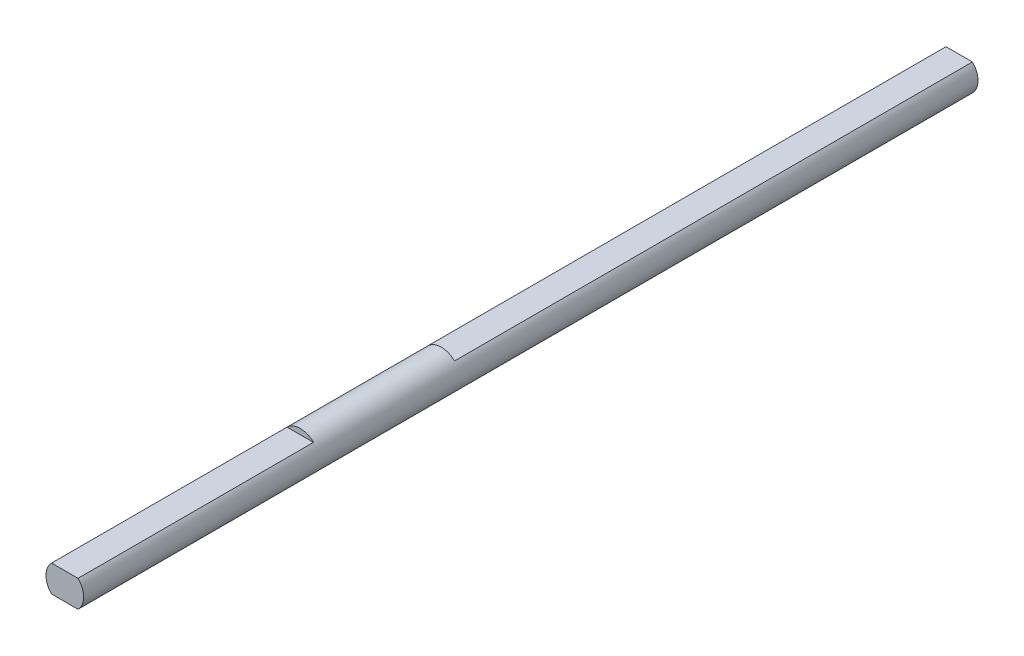
ISO-10303-21;
HEADER;
FILE_DESCRIPTION(('STEP AP214'),'2;1');
FILE_NAME('part.step','',(''),(''),'','','');
FILE_SCHEMA(('AUTOMOTIVE_DESIGN { 1 0 10303 214 1 1 1 1 }'));
ENDSEC;
DATA;
#1=APPLICATION_CONTEXT('core data for automotive mechanical design processes');
#2=APPLICATION_PROTOCOL_DEFINITION('international standard','automotive_design',2000,#1);
#3=PRODUCT_CONTEXT('',#1,'mechanical');
#4=PRODUCT('Part','Part','',(#3));
#5=PRODUCT_RELATED_PRODUCT_CATEGORY('part','',(#4));
#6=PRODUCT_DEFINITION_FORMATION('','',#4);
#7=PRODUCT_DEFINITION_CONTEXT('part definition',#1,'design');
#8=PRODUCT_DEFINITION('design','',#6,#7);
#9=PRODUCT_DEFINITION_SHAPE('','',#8);
#10=(LENGTH_UNIT() NAMED_UNIT(*) SI_UNIT(.MILLI.,.METRE.));
#11=(NAMED_UNIT(*) PLANE_ANGLE_UNIT() SI_UNIT($,.RADIAN.));
#12=(NAMED_UNIT(*) SI_UNIT($,.STERADIAN.) SOLID_ANGLE_UNIT());
#13=UNCERTAINTY_MEASURE_WITH_UNIT(LENGTH_MEASURE(1.E-05),#10,'distance_accuracy_value','');
#14=(GEOMETRIC_REPRESENTATION_CONTEXT(3) GLOBAL_UNCERTAINTY_ASSIGNED_CONTEXT((#13)) GLOBAL_UNIT_ASSIGNED_CONTEXT((#10,
#11,#12)) REPRESENTATION_CONTEXT('',''));
#15=CARTESIAN_POINT('',(0.,0.,0.));
#16=DIRECTION('',(0.,0.,1.));
#17=DIRECTION('',(1.,0.,0.));
#18=AXIS2_PLACEMENT_3D('',#15,#16,#17);
#19=CARTESIAN_POINT('',(0.,0.,-30.));
#20=DIRECTION('',(0.,0.,1.));
#21=DIRECTION('',(1.,0.,0.));
#22=AXIS2_PLACEMENT_3D('',#19,#20,#21);
#23=CYLINDRICAL_SURFACE('',#22,2.);
#24=DIRECTION('',(0.,0.,1.));
#25=VECTOR('',#24,1.);
#26=CARTESIAN_POINT('',(1.40334422006862,1.425,-30.));
#27=LINE('',#26,#25);
#28=CARTESIAN_POINT('',(1.40334422006862,1.425,25.015));
#29=VERTEX_POINT('',#28);
#30=CARTESIAN_POINT('',(1.40334422006862,1.425,-30.));
#31=VERTEX_POINT('',#30);
#32=EDGE_CURVE('E56',#29,#31,#27,.F.);
#33=ORIENTED_EDGE('',*,*,#32,.F.);
#34=CARTESIAN_POINT('',(0.,0.,25.015));
#35=DIRECTION('',(0.,0.,-1.));
#36=DIRECTION('',(-1.,0.,0.));
#37=AXIS2_PLACEMENT_3D('',#34,#35,#36);
#38=CIRCLE('',#37,2.);
#39=CARTESIAN_POINT('',(-1.40334422006862,1.425,25.015));
#40=VERTEX_POINT('',#39);
#41=EDGE_CURVE('E11',#29,#40,#38,.F.);
#42=ORIENTED_EDGE('',*,*,#41,.T.);
#43=DIRECTION('',(0.,0.,1.));
#44=VECTOR('',#43,1.);
#45=CARTESIAN_POINT('',(-1.40334422006862,1.425,-30.));
#46=LINE('',#45,#44);
#47=CARTESIAN_POINT('',(-1.40334422006862,1.425,-30.));
#48=VERTEX_POINT('',#47);
#49=EDGE_CURVE('E138',#48,#40,#46,.T.);
#50=ORIENTED_EDGE('',*,*,#49,.F.);
#51=CARTESIAN_POINT('',(0.,0.,-30.));
#52=DIRECTION('',(0.,0.,1.));
#53=DIRECTION('',(1.,0.,0.));
#54=AXIS2_PLACEMENT_3D('',#51,#52,#53);
#55=CIRCLE('',#54,2.);
#56=CARTESIAN_POINT('',(-1.40334422006862,-1.425,-30.));
#57=VERTEX_POINT('',#56);
#58=EDGE_CURVE('E117',#48,#57,#55,.T.);
#59=ORIENTED_EDGE('',*,*,#58,.T.);
#60=DIRECTION('',(0.,0.,1.));
#61=VECTOR('',#60,1.);
#62=CARTESIAN_POINT('',(-1.40334422006862,-1.425,-30.));
#63=LINE('',#62,#61);
#64=CARTESIAN_POINT('',(-1.40334422006862,-1.425,25.015));
#65=VERTEX_POINT('',#64);
#66=EDGE_CURVE('E48',#65,#57,#63,.F.);
#67=ORIENTED_EDGE('',*,*,#66,.F.);
#68=CARTESIAN_POINT('',(0.,0.,25.015));
#69=DIRECTION('',(0.,0.,1.));
#70=DIRECTION('',(1.,0.,0.));
#71=AXIS2_PLACEMENT_3D('',#68,#69,#70);
#72=CIRCLE('',#71,2.);
#73=CARTESIAN_POINT('',(1.40334422006862,-1.425,25.015));
#74=VERTEX_POINT('',#73);
#75=EDGE_CURVE('E41',#74,#65,#72,.F.);
#76=ORIENTED_EDGE('',*,*,#75,.F.);
#77=DIRECTION('',(0.,0.,1.));
#78=VECTOR('',#77,1.);
#79=CARTESIAN_POINT('',(1.40334422006862,-1.425,-30.));
#80=LINE('',#79,#78);
#81=CARTESIAN_POINT('',(1.40334422006862,-1.425,-30.));
#82=VERTEX_POINT('',#81);
#83=EDGE_CURVE('E100',#82,#74,#80,.T.);
#84=ORIENTED_EDGE('',*,*,#83,.F.);
#85=EDGE_CURVE('E113',#82,#31,#55,.T.);
#86=ORIENTED_EDGE('',*,*,#85,.T.);
#87=EDGE_LOOP('',(#33,#42,#50,#59,#67,#76,#84,#86));
#88=FACE_BOUND('',#87,.T.);
#89=DIRECTION('',(0.,0.,1.));
#90=VECTOR('',#89,1.);
#91=CARTESIAN_POINT('',(1.40334422006862,1.425,-30.));
#92=LINE('',#91,#90);
#93=CARTESIAN_POINT('',(1.40334422006862,1.425,65.));
#94=VERTEX_POINT('',#93);
#95=CARTESIAN_POINT('',(1.40334422006862,1.425,39.985));
#96=VERTEX_POINT('',#95);
#97=EDGE_CURVE('E154',#94,#96,#92,.F.);
#98=ORIENTED_EDGE('',*,*,#97,.F.);
#99=CARTESIAN_POINT('',(0.,0.,65.));
#100=DIRECTION('',(0.,0.,1.));
#101=DIRECTION('',(1.,0.,0.));
#102=AXIS2_PLACEMENT_3D('',#99,#100,#101);
#103=CIRCLE('',#102,2.);
#104=CARTESIAN_POINT('',(1.40334422006862,-1.425,65.));
#105=VERTEX_POINT('',#104);
#106=EDGE_CURVE('E122',#105,#94,#103,.T.);
#107=ORIENTED_EDGE('',*,*,#106,.F.);
#108=DIRECTION('',(0.,0.,1.));
#109=VECTOR('',#108,1.);
#110=CARTESIAN_POINT('',(1.40334422006862,-1.425,-30.));
#111=LINE('',#110,#109);
#112=CARTESIAN_POINT('',(1.40334422006862,-1.425,39.985));
#113=VERTEX_POINT('',#112);
#114=EDGE_CURVE('E147',#113,#105,#111,.T.);
#115=ORIENTED_EDGE('',*,*,#114,.F.);
#116=CARTESIAN_POINT('',(0.,0.,39.985));
#117=DIRECTION('',(0.,0.,-1.));
#118=DIRECTION('',(-1.,0.,0.));
#119=AXIS2_PLACEMENT_3D('',#116,#117,#118);
#120=CIRCLE('',#119,2.);
#121=CARTESIAN_POINT('',(-1.40334422006862,-1.425,39.985));
#122=VERTEX_POINT('',#121);
#123=EDGE_CURVE('E129',#122,#113,#120,.F.);
#124=ORIENTED_EDGE('',*,*,#123,.F.);
#125=DIRECTION('',(0.,0.,1.));
#126=VECTOR('',#125,1.);
#127=CARTESIAN_POINT('',(-1.40334422006862,-1.425,-30.));
#128=LINE('',#127,#126);
#129=CARTESIAN_POINT('',(-1.40334422006862,-1.425,65.));
#130=VERTEX_POINT('',#129);
#131=EDGE_CURVE('E151',#130,#122,#128,.F.);
#132=ORIENTED_EDGE('',*,*,#131,.F.);
#133=CARTESIAN_POINT('',(-1.40334422006862,1.425,65.));
#134=VERTEX_POINT('',#133);
#135=EDGE_CURVE('E118',#134,#130,#103,.T.);
#136=ORIENTED_EDGE('',*,*,#135,.F.);
#137=DIRECTION('',(0.,0.,1.));
#138=VECTOR('',#137,1.);
#139=CARTESIAN_POINT('',(-1.40334422006862,1.425,-30.));
#140=LINE('',#139,#138);
#141=CARTESIAN_POINT('',(-1.40334422006862,1.425,39.985));
#142=VERTEX_POINT('',#141);
#143=EDGE_CURVE('E153',#142,#134,#140,.T.);
#144=ORIENTED_EDGE('',*,*,#143,.F.);
#145=CARTESIAN_POINT('',(0.,0.,39.985));
#146=DIRECTION('',(0.,0.,1.));
#147=DIRECTION('',(1.,0.,0.));
#148=AXIS2_PLACEMENT_3D('',#145,#146,#147);
#149=CIRCLE('',#148,2.);
#150=EDGE_CURVE('E107',#142,#96,#149,.F.);
#151=ORIENTED_EDGE('',*,*,#150,.T.);
#152=EDGE_LOOP('',(#98,#107,#115,#124,#132,#136,#144,#151));
#153=FACE_BOUND('',#152,.T.);
#154=ADVANCED_FACE('F34',(#88,#153),#23,.T.);
#155=CARTESIAN_POINT('',(0.,0.,-30.));
#156=DIRECTION('',(0.,0.,1.));
#157=DIRECTION('',(1.,0.,0.));
#158=AXIS2_PLACEMENT_3D('',#155,#156,#157);
#159=PLANE('',#158);
#160=ORIENTED_EDGE('',*,*,#58,.F.);
#161=DIRECTION('',(1.,0.,0.));
#162=VECTOR('',#161,1.);
#163=CARTESIAN_POINT('',(0.,1.425,-30.));
#164=LINE('',#163,#162);
#165=EDGE_CURVE('E106',#48,#31,#164,.T.);
#166=ORIENTED_EDGE('',*,*,#165,.T.);
#167=ORIENTED_EDGE('',*,*,#85,.F.);
#168=DIRECTION('',(-1.,0.,0.));
#169=VECTOR('',#168,1.);
#170=CARTESIAN_POINT('',(0.,-1.425,-30.));
#171=LINE('',#170,#169);
#172=EDGE_CURVE('E97',#82,#57,#171,.T.);
#173=ORIENTED_EDGE('',*,*,#172,.T.);
#174=EDGE_LOOP('',(#160,#166,#167,#173));
#175=FACE_BOUND('',#174,.T.);
#176=ADVANCED_FACE('F116',(#175),#159,.F.);
#177=CARTESIAN_POINT('',(0.,0.,65.));
#178=DIRECTION('',(0.,0.,1.));
#179=DIRECTION('',(1.,0.,0.));
#180=AXIS2_PLACEMENT_3D('',#177,#178,#179);
#181=PLANE('',#180);
#182=DIRECTION('',(1.,0.,0.));
#183=VECTOR('',#182,1.);
#184=CARTESIAN_POINT('',(0.,1.425,65.));
#185=LINE('',#184,#183);
#186=EDGE_CURVE('E127',#134,#94,#185,.T.);
#187=ORIENTED_EDGE('',*,*,#186,.F.);
#188=ORIENTED_EDGE('',*,*,#135,.T.);
#189=DIRECTION('',(-1.,0.,0.));
#190=VECTOR('',#189,1.);
#191=CARTESIAN_POINT('',(0.,-1.425,65.));
#192=LINE('',#191,#190);
#193=EDGE_CURVE('E120',#105,#130,#192,.T.);
#194=ORIENTED_EDGE('',*,*,#193,.F.);
#195=ORIENTED_EDGE('',*,*,#106,.T.);
#196=EDGE_LOOP('',(#187,#188,#194,#195));
#197=FACE_BOUND('',#196,.T.);
#198=ADVANCED_FACE('F163',(#197),#181,.T.);
#199=CARTESIAN_POINT('',(0.,-1.425,39.985));
#200=DIRECTION('',(0.,1.,0.));
#201=DIRECTION('',(0.,0.,1.));
#202=AXIS2_PLACEMENT_3D('',#199,#200,#201);
#203=PLANE('',#202);
#204=ORIENTED_EDGE('',*,*,#131,.T.);
#205=DIRECTION('',(-1.,0.,0.));
#206=VECTOR('',#205,1.);
#207=CARTESIAN_POINT('',(-3.67257147029217,-1.425,39.985));
#208=LINE('',#207,#206);
#209=EDGE_CURVE('E143',#113,#122,#208,.T.);
#210=ORIENTED_EDGE('',*,*,#209,.F.);
#211=ORIENTED_EDGE('',*,*,#114,.T.);
#212=ORIENTED_EDGE('',*,*,#193,.T.);
#213=EDGE_LOOP('',(#204,#210,#211,#212));
#214=FACE_BOUND('',#213,.T.);
#215=ADVANCED_FACE('F179',(#214),#203,.F.);
#216=CARTESIAN_POINT('',(0.,0.,39.985));
#217=DIRECTION('',(0.,0.,-1.));
#218=DIRECTION('',(-1.,0.,0.));
#219=AXIS2_PLACEMENT_3D('',#216,#217,#218);
#220=PLANE('',#219);
#221=ORIENTED_EDGE('',*,*,#123,.T.);
#222=ORIENTED_EDGE('',*,*,#209,.T.);
#223=EDGE_LOOP('',(#221,#222));
#224=FACE_BOUND('',#223,.T.);
#225=ADVANCED_FACE('F172',(#224),#220,.F.);
#226=CARTESIAN_POINT('',(0.,1.425,39.985));
#227=DIRECTION('',(0.,-1.,0.));
#228=DIRECTION('',(0.,0.,-1.));
#229=AXIS2_PLACEMENT_3D('',#226,#227,#228);
#230=PLANE('',#229);
#231=ORIENTED_EDGE('',*,*,#97,.T.);
#232=DIRECTION('',(1.,0.,0.));
#233=VECTOR('',#232,1.);
#234=CARTESIAN_POINT('',(-3.67257147029217,1.425,39.985));
#235=LINE('',#234,#233);
#236=EDGE_CURVE('E144',#142,#96,#235,.T.);
#237=ORIENTED_EDGE('',*,*,#236,.F.);
#238=ORIENTED_EDGE('',*,*,#143,.T.);
#239=ORIENTED_EDGE('',*,*,#186,.T.);
#240=EDGE_LOOP('',(#231,#237,#238,#239));
#241=FACE_BOUND('',#240,.T.);
#242=ADVANCED_FACE('F170',(#241),#230,.F.);
#243=CARTESIAN_POINT('',(0.,0.,39.985));
#244=DIRECTION('',(0.,0.,1.));
#245=DIRECTION('',(1.,0.,0.));
#246=AXIS2_PLACEMENT_3D('',#243,#244,#245);
#247=PLANE('',#246);
#248=ORIENTED_EDGE('',*,*,#236,.T.);
#249=ORIENTED_EDGE('',*,*,#150,.F.);
#250=EDGE_LOOP('',(#248,#249));
#251=FACE_BOUND('',#250,.T.);
#252=ADVANCED_FACE('F169',(#251),#247,.T.);
#253=CARTESIAN_POINT('',(0.,-1.425,25.015));
#254=DIRECTION('',(0.,1.,0.));
#255=DIRECTION('',(0.,0.,1.));
#256=AXIS2_PLACEMENT_3D('',#253,#254,#255);
#257=PLANE('',#256);
#258=ORIENTED_EDGE('',*,*,#66,.T.);
#259=ORIENTED_EDGE('',*,*,#172,.F.);
#260=ORIENTED_EDGE('',*,*,#83,.T.);
#261=DIRECTION('',(1.,0.,0.));
#262=VECTOR('',#261,1.);
#263=CARTESIAN_POINT('',(2.87181676904782,-1.425,25.015));
#264=LINE('',#263,#262);
#265=EDGE_CURVE('E135',#65,#74,#264,.T.);
#266=ORIENTED_EDGE('',*,*,#265,.F.);
#267=EDGE_LOOP('',(#258,#259,#260,#266));
#268=FACE_BOUND('',#267,.T.);
#269=ADVANCED_FACE('F99',(#268),#257,.F.);
#270=CARTESIAN_POINT('',(0.,0.,25.015));
#271=DIRECTION('',(0.,0.,1.));
#272=DIRECTION('',(1.,0.,0.));
#273=AXIS2_PLACEMENT_3D('',#270,#271,#272);
#274=PLANE('',#273);
#275=ORIENTED_EDGE('',*,*,#75,.T.);
#276=ORIENTED_EDGE('',*,*,#265,.T.);
#277=EDGE_LOOP('',(#275,#276));
#278=FACE_BOUND('',#277,.T.);
#279=ADVANCED_FACE('F134',(#278),#274,.F.);
#280=CARTESIAN_POINT('',(0.,1.425,25.015));
#281=DIRECTION('',(0.,-1.,0.));
#282=DIRECTION('',(0.,0.,-1.));
#283=AXIS2_PLACEMENT_3D('',#280,#281,#282);
#284=PLANE('',#283);
#285=ORIENTED_EDGE('',*,*,#32,.T.);
#286=ORIENTED_EDGE('',*,*,#165,.F.);
#287=ORIENTED_EDGE('',*,*,#49,.T.);
#288=DIRECTION('',(-1.,0.,0.));
#289=VECTOR('',#288,1.);
#290=CARTESIAN_POINT('',(2.87181676904782,1.425,25.015));
#291=LINE('',#290,#289);
#292=EDGE_CURVE('E114',#29,#40,#291,.T.);
#293=ORIENTED_EDGE('',*,*,#292,.F.);
#294=EDGE_LOOP('',(#285,#286,#287,#293));
#295=FACE_BOUND('',#294,.T.);
#296=ADVANCED_FACE('F241',(#295),#284,.F.);
#297=CARTESIAN_POINT('',(0.,0.,25.015));
#298=DIRECTION('',(0.,0.,-1.));
#299=DIRECTION('',(-1.,0.,0.));
#300=AXIS2_PLACEMENT_3D('',#297,#298,#299);
#301=PLANE('',#300);
#302=ORIENTED_EDGE('',*,*,#292,.T.);
#303=ORIENTED_EDGE('',*,*,#41,.F.);
#304=EDGE_LOOP('',(#302,#303));
#305=FACE_BOUND('',#304,.T.);
#306=ADVANCED_FACE('F251',(#305),#301,.T.);
#307=CLOSED_SHELL('',(#154,#176,#198,#215,#225,#242,#252,#269,#279,#296,#306));
#308=MANIFOLD_SOLID_BREP('B2',#307);
#309=ADVANCED_BREP_SHAPE_REPRESENTATION('',(#18,#308),#14);
#310=SHAPE_DEFINITION_REPRESENTATION(#9,#309);
ENDSEC;
END-ISO-10303-21;
